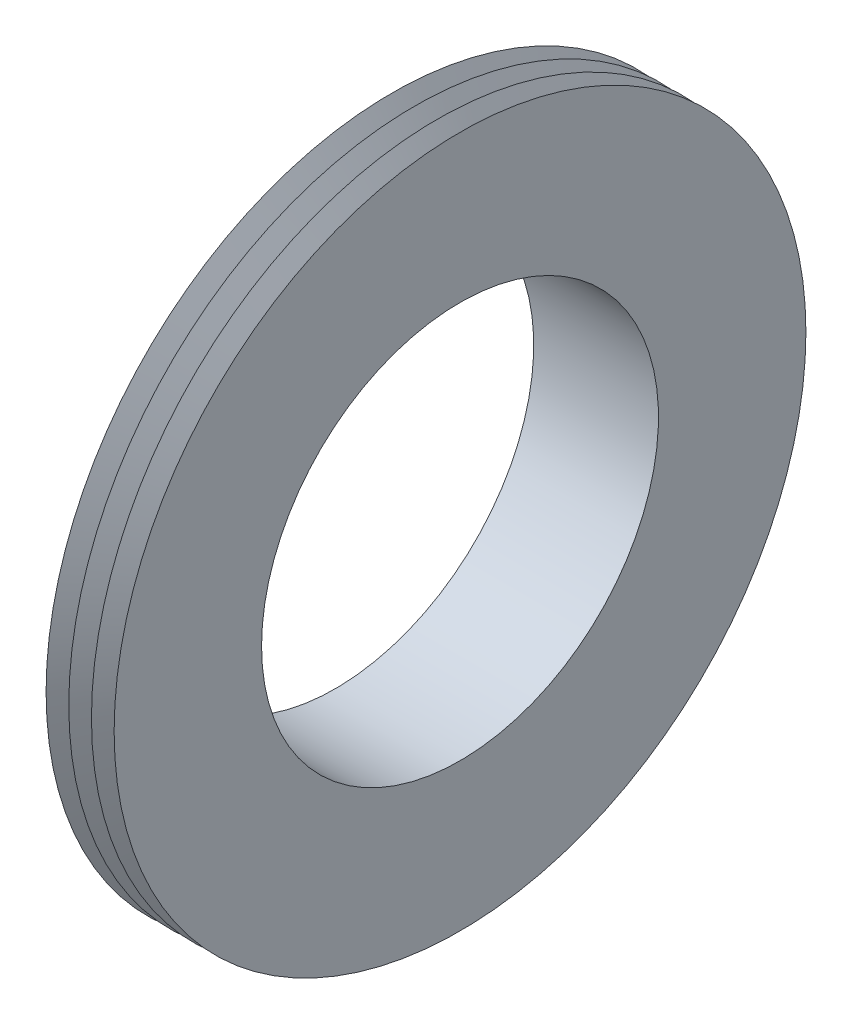
ISO-10303-21;
HEADER;
FILE_DESCRIPTION(('STEP AP214'),'2;1');
FILE_NAME('part.step','',(''),(''),'','','');
FILE_SCHEMA(('AUTOMOTIVE_DESIGN { 1 0 10303 214 1 1 1 1 }'));
ENDSEC;
DATA;
#1=APPLICATION_CONTEXT('core data for automotive mechanical design processes');
#2=APPLICATION_PROTOCOL_DEFINITION('international standard','automotive_design',2000,#1);
#3=PRODUCT_CONTEXT('',#1,'mechanical');
#4=PRODUCT('Part','Part','',(#3));
#5=PRODUCT_RELATED_PRODUCT_CATEGORY('part','',(#4));
#6=PRODUCT_DEFINITION_FORMATION('','',#4);
#7=PRODUCT_DEFINITION_CONTEXT('part definition',#1,'design');
#8=PRODUCT_DEFINITION('design','',#6,#7);
#9=PRODUCT_DEFINITION_SHAPE('','',#8);
#10=(LENGTH_UNIT() NAMED_UNIT(*) SI_UNIT(.MILLI.,.METRE.));
#11=(NAMED_UNIT(*) PLANE_ANGLE_UNIT() SI_UNIT($,.RADIAN.));
#12=(NAMED_UNIT(*) SI_UNIT($,.STERADIAN.) SOLID_ANGLE_UNIT());
#13=UNCERTAINTY_MEASURE_WITH_UNIT(LENGTH_MEASURE(1.E-05),#10,'distance_accuracy_value','');
#14=(GEOMETRIC_REPRESENTATION_CONTEXT(3) GLOBAL_UNCERTAINTY_ASSIGNED_CONTEXT((#13)) GLOBAL_UNIT_ASSIGNED_CONTEXT((#10,
#11,#12)) REPRESENTATION_CONTEXT('',''));
#15=CARTESIAN_POINT('',(0.,0.,0.));
#16=DIRECTION('',(0.,0.,1.));
#17=DIRECTION('',(1.,0.,0.));
#18=AXIS2_PLACEMENT_3D('',#15,#16,#17);
#19=CARTESIAN_POINT('',(11.,0.,0.));
#20=DIRECTION('',(1.,0.,0.));
#21=DIRECTION('',(0.,0.,-1.));
#22=AXIS2_PLACEMENT_3D('',#19,#20,#21);
#23=PLANE('',#22);
#24=CARTESIAN_POINT('',(11.,0.,0.));
#25=DIRECTION('',(-1.,0.,0.));
#26=DIRECTION('',(0.,0.,1.));
#27=AXIS2_PLACEMENT_3D('',#24,#25,#26);
#28=CIRCLE('',#27,17.5);
#29=CARTESIAN_POINT('',(11.,0.,17.5));
#30=VERTEX_POINT('',#29);
#31=EDGE_CURVE('E72',#30,#30,#28,.T.);
#32=ORIENTED_EDGE('',*,*,#31,.T.);
#33=EDGE_LOOP('',(#32));
#34=FACE_BOUND('',#33,.T.);
#35=CARTESIAN_POINT('',(11.,0.,0.));
#36=DIRECTION('',(-1.,0.,0.));
#37=DIRECTION('',(0.,0.,1.));
#38=AXIS2_PLACEMENT_3D('',#35,#36,#37);
#39=CIRCLE('',#38,30.5);
#40=CARTESIAN_POINT('',(11.,0.,30.5));
#41=VERTEX_POINT('',#40);
#42=EDGE_CURVE('E10',#41,#41,#39,.T.);
#43=ORIENTED_EDGE('',*,*,#42,.F.);
#44=EDGE_LOOP('',(#43));
#45=FACE_BOUND('',#44,.T.);
#46=ADVANCED_FACE('F35',(#34,#45),#23,.T.);
#47=CARTESIAN_POINT('',(9.99999999999998,0.,0.));
#48=DIRECTION('',(1.,0.,0.));
#49=DIRECTION('',(0.,0.,-1.));
#50=AXIS2_PLACEMENT_3D('',#47,#48,#49);
#51=CONICAL_SURFACE('',#50,28.7679491924311,1.04719755119659);
#52=ORIENTED_EDGE('',*,*,#42,.T.);
#53=EDGE_LOOP('',(#52));
#54=FACE_BOUND('',#53,.T.);
#55=CARTESIAN_POINT('',(9.99999999999998,0.,0.));
#56=DIRECTION('',(-1.,0.,0.));
#57=DIRECTION('',(0.,0.,1.));
#58=AXIS2_PLACEMENT_3D('',#55,#56,#57);
#59=CIRCLE('',#58,28.7679491924311);
#60=CARTESIAN_POINT('',(9.99999999999998,0.,28.7679491924311));
#61=VERTEX_POINT('',#60);
#62=EDGE_CURVE('E41',#61,#61,#59,.T.);
#63=ORIENTED_EDGE('',*,*,#62,.F.);
#64=EDGE_LOOP('',(#63));
#65=FACE_BOUND('',#64,.T.);
#66=ADVANCED_FACE('F96',(#54,#65),#51,.T.);
#67=CARTESIAN_POINT('',(9.,0.,0.));
#68=DIRECTION('',(-1.,0.,0.));
#69=DIRECTION('',(0.,0.,1.));
#70=AXIS2_PLACEMENT_3D('',#67,#68,#69);
#71=CONICAL_SURFACE('',#70,30.5,1.0471975511966);
#72=ORIENTED_EDGE('',*,*,#62,.T.);
#73=EDGE_LOOP('',(#72));
#74=FACE_BOUND('',#73,.T.);
#75=CARTESIAN_POINT('',(9.,0.,0.));
#76=DIRECTION('',(-1.,0.,0.));
#77=DIRECTION('',(0.,0.,1.));
#78=AXIS2_PLACEMENT_3D('',#75,#76,#77);
#79=CIRCLE('',#78,30.5);
#80=CARTESIAN_POINT('',(9.,0.,30.5));
#81=VERTEX_POINT('',#80);
#82=EDGE_CURVE('E45',#81,#81,#79,.T.);
#83=ORIENTED_EDGE('',*,*,#82,.F.);
#84=EDGE_LOOP('',(#83));
#85=FACE_BOUND('',#84,.T.);
#86=ADVANCED_FACE('F100',(#74,#85),#71,.T.);
#87=CARTESIAN_POINT('',(7.99999999999999,0.,0.));
#88=DIRECTION('',(1.,0.,0.));
#89=DIRECTION('',(0.,0.,-1.));
#90=AXIS2_PLACEMENT_3D('',#87,#88,#89);
#91=CONICAL_SURFACE('',#90,28.7679491924311,1.0471975511966);
#92=ORIENTED_EDGE('',*,*,#82,.T.);
#93=EDGE_LOOP('',(#92));
#94=FACE_BOUND('',#93,.T.);
#95=CARTESIAN_POINT('',(7.99999999999999,0.,0.));
#96=DIRECTION('',(-1.,0.,0.));
#97=DIRECTION('',(0.,0.,1.));
#98=AXIS2_PLACEMENT_3D('',#95,#96,#97);
#99=CIRCLE('',#98,28.7679491924311);
#100=CARTESIAN_POINT('',(7.99999999999999,0.,28.7679491924311));
#101=VERTEX_POINT('',#100);
#102=EDGE_CURVE('E49',#101,#101,#99,.T.);
#103=ORIENTED_EDGE('',*,*,#102,.F.);
#104=EDGE_LOOP('',(#103));
#105=FACE_BOUND('',#104,.T.);
#106=ADVANCED_FACE('F104',(#94,#105),#91,.T.);
#107=CARTESIAN_POINT('',(7.,0.,0.));
#108=DIRECTION('',(-1.,0.,0.));
#109=DIRECTION('',(0.,0.,1.));
#110=AXIS2_PLACEMENT_3D('',#107,#108,#109);
#111=CONICAL_SURFACE('',#110,30.5,1.0471975511966);
#112=ORIENTED_EDGE('',*,*,#102,.T.);
#113=EDGE_LOOP('',(#112));
#114=FACE_BOUND('',#113,.T.);
#115=CARTESIAN_POINT('',(7.,0.,0.));
#116=DIRECTION('',(-1.,0.,0.));
#117=DIRECTION('',(0.,0.,1.));
#118=AXIS2_PLACEMENT_3D('',#115,#116,#117);
#119=CIRCLE('',#118,30.5);
#120=CARTESIAN_POINT('',(7.,0.,30.5));
#121=VERTEX_POINT('',#120);
#122=EDGE_CURVE('E54',#121,#121,#119,.T.);
#123=ORIENTED_EDGE('',*,*,#122,.F.);
#124=EDGE_LOOP('',(#123));
#125=FACE_BOUND('',#124,.T.);
#126=ADVANCED_FACE('F110',(#114,#125),#111,.T.);
#127=CARTESIAN_POINT('',(5.99999999999999,0.,0.));
#128=DIRECTION('',(1.,0.,0.));
#129=DIRECTION('',(0.,0.,-1.));
#130=AXIS2_PLACEMENT_3D('',#127,#128,#129);
#131=CONICAL_SURFACE('',#130,28.7679491924311,1.04719755119659);
#132=ORIENTED_EDGE('',*,*,#122,.T.);
#133=EDGE_LOOP('',(#132));
#134=FACE_BOUND('',#133,.T.);
#135=CARTESIAN_POINT('',(5.99999999999999,0.,0.));
#136=DIRECTION('',(-1.,0.,0.));
#137=DIRECTION('',(0.,0.,1.));
#138=AXIS2_PLACEMENT_3D('',#135,#136,#137);
#139=CIRCLE('',#138,28.7679491924311);
#140=CARTESIAN_POINT('',(5.99999999999999,0.,28.7679491924311));
#141=VERTEX_POINT('',#140);
#142=EDGE_CURVE('E57',#141,#141,#139,.T.);
#143=ORIENTED_EDGE('',*,*,#142,.F.);
#144=EDGE_LOOP('',(#143));
#145=FACE_BOUND('',#144,.T.);
#146=ADVANCED_FACE('F114',(#134,#145),#131,.T.);
#147=CARTESIAN_POINT('',(5.,0.,0.));
#148=DIRECTION('',(-1.,0.,0.));
#149=DIRECTION('',(0.,0.,1.));
#150=AXIS2_PLACEMENT_3D('',#147,#148,#149);
#151=CONICAL_SURFACE('',#150,30.5,1.0471975511966);
#152=ORIENTED_EDGE('',*,*,#142,.T.);
#153=EDGE_LOOP('',(#152));
#154=FACE_BOUND('',#153,.T.);
#155=CARTESIAN_POINT('',(5.,0.,0.));
#156=DIRECTION('',(-1.,0.,0.));
#157=DIRECTION('',(0.,0.,1.));
#158=AXIS2_PLACEMENT_3D('',#155,#156,#157);
#159=CIRCLE('',#158,30.5);
#160=CARTESIAN_POINT('',(5.,0.,30.5));
#161=VERTEX_POINT('',#160);
#162=EDGE_CURVE('E60',#161,#161,#159,.T.);
#163=ORIENTED_EDGE('',*,*,#162,.F.);
#164=EDGE_LOOP('',(#163));
#165=FACE_BOUND('',#164,.T.);
#166=ADVANCED_FACE('F118',(#154,#165),#151,.T.);
#167=CARTESIAN_POINT('',(5.,0.,0.));
#168=DIRECTION('',(-1.,0.,0.));
#169=DIRECTION('',(0.,0.,1.));
#170=AXIS2_PLACEMENT_3D('',#167,#168,#169);
#171=PLANE('',#170);
#172=ORIENTED_EDGE('',*,*,#162,.T.);
#173=EDGE_LOOP('',(#172));
#174=FACE_BOUND('',#173,.T.);
#175=CARTESIAN_POINT('',(5.,0.,0.));
#176=DIRECTION('',(-1.,0.,0.));
#177=DIRECTION('',(0.,0.,1.));
#178=AXIS2_PLACEMENT_3D('',#175,#176,#177);
#179=CIRCLE('',#178,21.5);
#180=CARTESIAN_POINT('',(5.,0.,21.5));
#181=VERTEX_POINT('',#180);
#182=EDGE_CURVE('E63',#181,#181,#179,.T.);
#183=ORIENTED_EDGE('',*,*,#182,.F.);
#184=EDGE_LOOP('',(#183));
#185=FACE_BOUND('',#184,.T.);
#186=ADVANCED_FACE('F92',(#174,#185),#171,.T.);
#187=CARTESIAN_POINT('',(0.,0.,0.));
#188=DIRECTION('',(-1.,0.,0.));
#189=DIRECTION('',(0.,0.,1.));
#190=AXIS2_PLACEMENT_3D('',#187,#188,#189);
#191=CYLINDRICAL_SURFACE('',#190,21.5);
#192=ORIENTED_EDGE('',*,*,#182,.T.);
#193=EDGE_LOOP('',(#192));
#194=FACE_BOUND('',#193,.T.);
#195=CARTESIAN_POINT('',(0.,0.,0.));
#196=DIRECTION('',(-1.,0.,0.));
#197=DIRECTION('',(0.,0.,1.));
#198=AXIS2_PLACEMENT_3D('',#195,#196,#197);
#199=CIRCLE('',#198,21.5);
#200=CARTESIAN_POINT('',(0.,0.,21.5));
#201=VERTEX_POINT('',#200);
#202=EDGE_CURVE('E66',#201,#201,#199,.T.);
#203=ORIENTED_EDGE('',*,*,#202,.F.);
#204=EDGE_LOOP('',(#203));
#205=FACE_BOUND('',#204,.T.);
#206=ADVANCED_FACE('F86',(#194,#205),#191,.T.);
#207=CARTESIAN_POINT('',(0.,0.,0.));
#208=DIRECTION('',(-1.,0.,0.));
#209=DIRECTION('',(0.,0.,1.));
#210=AXIS2_PLACEMENT_3D('',#207,#208,#209);
#211=PLANE('',#210);
#212=ORIENTED_EDGE('',*,*,#202,.T.);
#213=EDGE_LOOP('',(#212));
#214=FACE_BOUND('',#213,.T.);
#215=CARTESIAN_POINT('',(0.,0.,0.));
#216=DIRECTION('',(-1.,0.,0.));
#217=DIRECTION('',(0.,0.,1.));
#218=AXIS2_PLACEMENT_3D('',#215,#216,#217);
#219=CIRCLE('',#218,17.5);
#220=CARTESIAN_POINT('',(0.,0.,17.5));
#221=VERTEX_POINT('',#220);
#222=EDGE_CURVE('E69',#221,#221,#219,.T.);
#223=ORIENTED_EDGE('',*,*,#222,.F.);
#224=EDGE_LOOP('',(#223));
#225=FACE_BOUND('',#224,.T.);
#226=ADVANCED_FACE('F81',(#214,#225),#211,.T.);
#227=CARTESIAN_POINT('',(0.,0.,0.));
#228=DIRECTION('',(-1.,0.,0.));
#229=DIRECTION('',(0.,0.,1.));
#230=AXIS2_PLACEMENT_3D('',#227,#228,#229);
#231=CYLINDRICAL_SURFACE('',#230,17.5);
#232=ORIENTED_EDGE('',*,*,#31,.F.);
#233=EDGE_LOOP('',(#232));
#234=FACE_BOUND('',#233,.T.);
#235=ORIENTED_EDGE('',*,*,#222,.T.);
#236=EDGE_LOOP('',(#235));
#237=FACE_BOUND('',#236,.T.);
#238=ADVANCED_FACE('F78',(#234,#237),#231,.F.);
#239=CLOSED_SHELL('',(#46,#66,#86,#106,#126,#146,#166,#186,#206,#226,#238));
#240=MANIFOLD_SOLID_BREP('B2',#239);
#241=ADVANCED_BREP_SHAPE_REPRESENTATION('',(#18,#240),#14);
#242=SHAPE_DEFINITION_REPRESENTATION(#9,#241);
ENDSEC;
END-ISO-10303-21;
